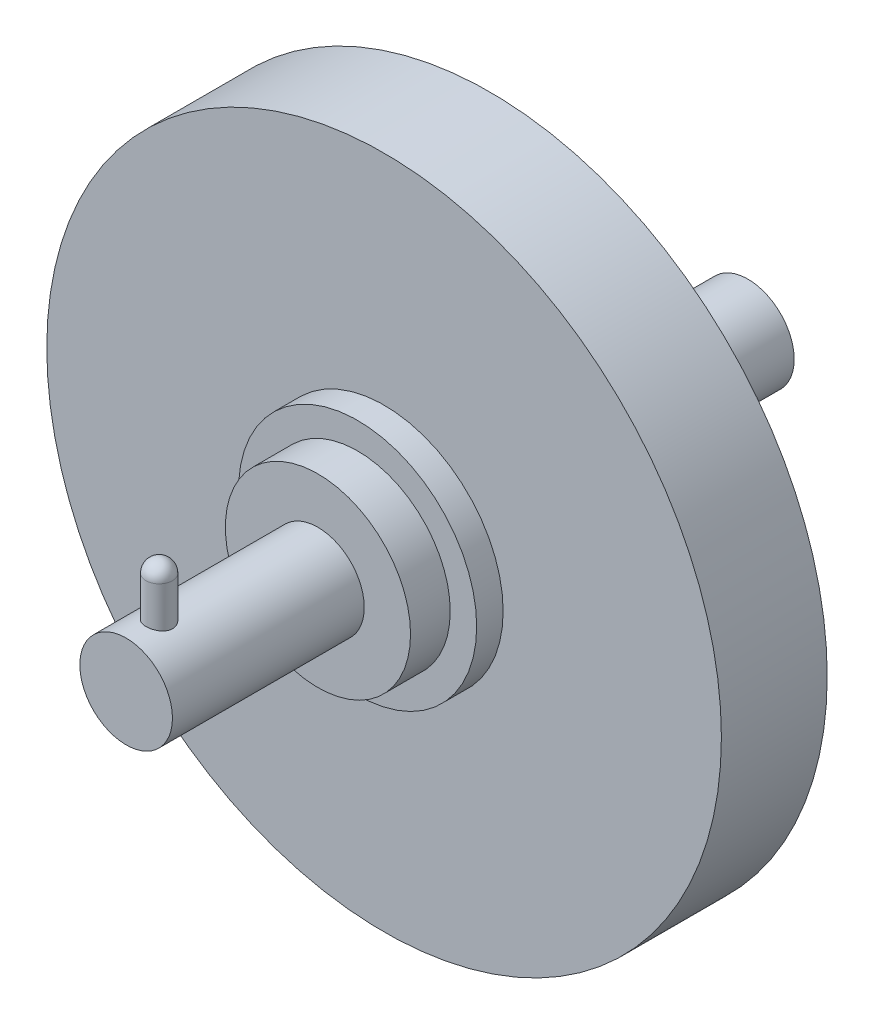
ISO-10303-21;
HEADER;
FILE_DESCRIPTION(('STEP AP214'),'2;1');
FILE_NAME('part.step','',(''),(''),'','','');
FILE_SCHEMA(('AUTOMOTIVE_DESIGN { 1 0 10303 214 1 1 1 1 }'));
ENDSEC;
DATA;
#1=APPLICATION_CONTEXT('core data for automotive mechanical design processes');
#2=APPLICATION_PROTOCOL_DEFINITION('international standard','automotive_design',2000,#1);
#3=PRODUCT_CONTEXT('',#1,'mechanical');
#4=PRODUCT('Part','Part','',(#3));
#5=PRODUCT_RELATED_PRODUCT_CATEGORY('part','',(#4));
#6=PRODUCT_DEFINITION_FORMATION('','',#4);
#7=PRODUCT_DEFINITION_CONTEXT('part definition',#1,'design');
#8=PRODUCT_DEFINITION('design','',#6,#7);
#9=PRODUCT_DEFINITION_SHAPE('','',#8);
#10=(LENGTH_UNIT() NAMED_UNIT(*) SI_UNIT(.MILLI.,.METRE.));
#11=(NAMED_UNIT(*) PLANE_ANGLE_UNIT() SI_UNIT($,.RADIAN.));
#12=(NAMED_UNIT(*) SI_UNIT($,.STERADIAN.) SOLID_ANGLE_UNIT());
#13=UNCERTAINTY_MEASURE_WITH_UNIT(LENGTH_MEASURE(1.E-05),#10,'distance_accuracy_value','');
#14=(GEOMETRIC_REPRESENTATION_CONTEXT(3) GLOBAL_UNCERTAINTY_ASSIGNED_CONTEXT((#13)) GLOBAL_UNIT_ASSIGNED_CONTEXT((#10,
#11,#12)) REPRESENTATION_CONTEXT('',''));
#15=CARTESIAN_POINT('',(0.,0.,0.));
#16=DIRECTION('',(0.,0.,1.));
#17=DIRECTION('',(1.,0.,0.));
#18=AXIS2_PLACEMENT_3D('',#15,#16,#17);
#19=CARTESIAN_POINT('',(0.,0.,101.6));
#20=DIRECTION('',(0.,0.,-1.));
#21=DIRECTION('',(-1.,0.,0.));
#22=AXIS2_PLACEMENT_3D('',#19,#20,#21);
#23=CYLINDRICAL_SURFACE('',#22,323.85);
#24=CARTESIAN_POINT('',(0.,0.,101.6));
#25=DIRECTION('',(0.,0.,1.));
#26=DIRECTION('',(1.,0.,0.));
#27=AXIS2_PLACEMENT_3D('',#24,#25,#26);
#28=CIRCLE('',#27,323.85);
#29=CARTESIAN_POINT('',(323.85,0.,101.6));
#30=VERTEX_POINT('',#29);
#31=EDGE_CURVE('E146',#30,#30,#28,.T.);
#32=ORIENTED_EDGE('',*,*,#31,.F.);
#33=EDGE_LOOP('',(#32));
#34=FACE_BOUND('',#33,.T.);
#35=CARTESIAN_POINT('',(0.,0.,0.));
#36=DIRECTION('',(0.,0.,1.));
#37=DIRECTION('',(1.,0.,0.));
#38=AXIS2_PLACEMENT_3D('',#35,#36,#37);
#39=CIRCLE('',#38,323.85);
#40=CARTESIAN_POINT('',(323.85,0.,0.));
#41=VERTEX_POINT('',#40);
#42=EDGE_CURVE('E149',#41,#41,#39,.T.);
#43=ORIENTED_EDGE('',*,*,#42,.T.);
#44=EDGE_LOOP('',(#43));
#45=FACE_BOUND('',#44,.T.);
#46=ADVANCED_FACE('F33',(#34,#45),#23,.T.);
#47=CARTESIAN_POINT('',(0.,0.,101.6));
#48=DIRECTION('',(0.,0.,1.));
#49=DIRECTION('',(1.,0.,0.));
#50=AXIS2_PLACEMENT_3D('',#47,#48,#49);
#51=PLANE('',#50);
#52=CARTESIAN_POINT('',(0.,0.,101.6));
#53=DIRECTION('',(0.,0.,1.));
#54=DIRECTION('',(1.,0.,0.));
#55=AXIS2_PLACEMENT_3D('',#52,#53,#54);
#56=CIRCLE('',#55,114.3);
#57=CARTESIAN_POINT('',(114.3,0.,101.6));
#58=VERTEX_POINT('',#57);
#59=EDGE_CURVE('E143',#58,#58,#56,.T.);
#60=ORIENTED_EDGE('',*,*,#59,.F.);
#61=EDGE_LOOP('',(#60));
#62=FACE_BOUND('',#61,.T.);
#63=ORIENTED_EDGE('',*,*,#31,.T.);
#64=EDGE_LOOP('',(#63));
#65=FACE_BOUND('',#64,.T.);
#66=ADVANCED_FACE('F84',(#62,#65),#51,.T.);
#67=CARTESIAN_POINT('',(0.,0.,0.));
#68=DIRECTION('',(0.,0.,1.));
#69=DIRECTION('',(1.,0.,0.));
#70=AXIS2_PLACEMENT_3D('',#67,#68,#69);
#71=PLANE('',#70);
#72=CARTESIAN_POINT('',(0.,0.,0.));
#73=DIRECTION('',(0.,0.,1.));
#74=DIRECTION('',(1.,0.,0.));
#75=AXIS2_PLACEMENT_3D('',#72,#73,#74);
#76=CIRCLE('',#75,114.3);
#77=CARTESIAN_POINT('',(114.3,0.,0.));
#78=VERTEX_POINT('',#77);
#79=EDGE_CURVE('E142',#78,#78,#76,.T.);
#80=ORIENTED_EDGE('',*,*,#79,.T.);
#81=EDGE_LOOP('',(#80));
#82=FACE_BOUND('',#81,.T.);
#83=ORIENTED_EDGE('',*,*,#42,.F.);
#84=EDGE_LOOP('',(#83));
#85=FACE_BOUND('',#84,.T.);
#86=ADVANCED_FACE('F89',(#82,#85),#71,.F.);
#87=CARTESIAN_POINT('',(0.,0.,-25.4));
#88=DIRECTION('',(0.,0.,1.));
#89=DIRECTION('',(1.,0.,0.));
#90=AXIS2_PLACEMENT_3D('',#87,#88,#89);
#91=PLANE('',#90);
#92=CARTESIAN_POINT('',(0.,0.,-25.4));
#93=DIRECTION('',(0.,0.,1.));
#94=DIRECTION('',(1.,0.,0.));
#95=AXIS2_PLACEMENT_3D('',#92,#93,#94);
#96=CIRCLE('',#95,88.9);
#97=CARTESIAN_POINT('',(88.9,0.,-25.4));
#98=VERTEX_POINT('',#97);
#99=EDGE_CURVE('E128',#98,#98,#96,.T.);
#100=ORIENTED_EDGE('',*,*,#99,.T.);
#101=EDGE_LOOP('',(#100));
#102=FACE_BOUND('',#101,.T.);
#103=CARTESIAN_POINT('',(0.,0.,-25.4));
#104=DIRECTION('',(0.,0.,1.));
#105=DIRECTION('',(1.,0.,0.));
#106=AXIS2_PLACEMENT_3D('',#103,#104,#105);
#107=CIRCLE('',#106,114.3);
#108=CARTESIAN_POINT('',(114.3,0.,-25.4));
#109=VERTEX_POINT('',#108);
#110=EDGE_CURVE('E139',#109,#109,#107,.T.);
#111=ORIENTED_EDGE('',*,*,#110,.F.);
#112=EDGE_LOOP('',(#111));
#113=FACE_BOUND('',#112,.T.);
#114=ADVANCED_FACE('F96',(#102,#113),#91,.F.);
#115=CARTESIAN_POINT('',(0.,0.,-25.4));
#116=DIRECTION('',(0.,0.,1.));
#117=DIRECTION('',(1.,0.,0.));
#118=AXIS2_PLACEMENT_3D('',#115,#116,#117);
#119=CYLINDRICAL_SURFACE('',#118,114.3);
#120=ORIENTED_EDGE('',*,*,#110,.T.);
#121=EDGE_LOOP('',(#120));
#122=FACE_BOUND('',#121,.T.);
#123=ORIENTED_EDGE('',*,*,#79,.F.);
#124=EDGE_LOOP('',(#123));
#125=FACE_BOUND('',#124,.T.);
#126=ADVANCED_FACE('F103',(#122,#125),#119,.T.);
#127=ORIENTED_EDGE('',*,*,#59,.T.);
#128=EDGE_LOOP('',(#127));
#129=FACE_BOUND('',#128,.T.);
#130=CARTESIAN_POINT('',(0.,0.,127.));
#131=DIRECTION('',(0.,0.,1.));
#132=DIRECTION('',(1.,0.,0.));
#133=AXIS2_PLACEMENT_3D('',#130,#131,#132);
#134=CIRCLE('',#133,114.3);
#135=CARTESIAN_POINT('',(114.3,0.,127.));
#136=VERTEX_POINT('',#135);
#137=EDGE_CURVE('E136',#136,#136,#134,.T.);
#138=ORIENTED_EDGE('',*,*,#137,.F.);
#139=EDGE_LOOP('',(#138));
#140=FACE_BOUND('',#139,.T.);
#141=ADVANCED_FACE('F99',(#129,#140),#119,.T.);
#142=CARTESIAN_POINT('',(0.,0.,127.));
#143=DIRECTION('',(0.,0.,1.));
#144=DIRECTION('',(1.,0.,0.));
#145=AXIS2_PLACEMENT_3D('',#142,#143,#144);
#146=PLANE('',#145);
#147=CARTESIAN_POINT('',(0.,0.,127.));
#148=DIRECTION('',(0.,0.,1.));
#149=DIRECTION('',(1.,0.,0.));
#150=AXIS2_PLACEMENT_3D('',#147,#148,#149);
#151=CIRCLE('',#150,88.9);
#152=CARTESIAN_POINT('',(88.9,0.,127.));
#153=VERTEX_POINT('',#152);
#154=EDGE_CURVE('E48',#153,#153,#151,.T.);
#155=ORIENTED_EDGE('',*,*,#154,.F.);
#156=EDGE_LOOP('',(#155));
#157=FACE_BOUND('',#156,.T.);
#158=ORIENTED_EDGE('',*,*,#137,.T.);
#159=EDGE_LOOP('',(#158));
#160=FACE_BOUND('',#159,.T.);
#161=ADVANCED_FACE('F102',(#157,#160),#146,.T.);
#162=CARTESIAN_POINT('',(0.,0.,165.1));
#163=DIRECTION('',(0.,0.,1.));
#164=DIRECTION('',(1.,0.,0.));
#165=AXIS2_PLACEMENT_3D('',#162,#163,#164);
#166=PLANE('',#165);
#167=CARTESIAN_POINT('',(0.,0.,165.1));
#168=DIRECTION('',(0.,0.,1.));
#169=DIRECTION('',(1.,0.,0.));
#170=AXIS2_PLACEMENT_3D('',#167,#168,#169);
#171=CIRCLE('',#170,44.45);
#172=CARTESIAN_POINT('',(44.45,0.,165.1));
#173=VERTEX_POINT('',#172);
#174=EDGE_CURVE('E44',#173,#173,#171,.T.);
#175=ORIENTED_EDGE('',*,*,#174,.F.);
#176=EDGE_LOOP('',(#175));
#177=FACE_BOUND('',#176,.T.);
#178=CARTESIAN_POINT('',(0.,0.,165.1));
#179=DIRECTION('',(0.,0.,1.));
#180=DIRECTION('',(1.,0.,0.));
#181=AXIS2_PLACEMENT_3D('',#178,#179,#180);
#182=CIRCLE('',#181,88.9);
#183=CARTESIAN_POINT('',(88.9,0.,165.1));
#184=VERTEX_POINT('',#183);
#185=EDGE_CURVE('E123',#184,#184,#182,.T.);
#186=ORIENTED_EDGE('',*,*,#185,.T.);
#187=EDGE_LOOP('',(#186));
#188=FACE_BOUND('',#187,.T.);
#189=ADVANCED_FACE('F110',(#177,#188),#166,.T.);
#190=CARTESIAN_POINT('',(0.,0.,-63.5));
#191=DIRECTION('',(0.,0.,1.));
#192=DIRECTION('',(1.,0.,0.));
#193=AXIS2_PLACEMENT_3D('',#190,#191,#192);
#194=CYLINDRICAL_SURFACE('',#193,88.9);
#195=ORIENTED_EDGE('',*,*,#154,.T.);
#196=EDGE_LOOP('',(#195));
#197=FACE_BOUND('',#196,.T.);
#198=ORIENTED_EDGE('',*,*,#185,.F.);
#199=EDGE_LOOP('',(#198));
#200=FACE_BOUND('',#199,.T.);
#201=ADVANCED_FACE('F112',(#197,#200),#194,.T.);
#202=CARTESIAN_POINT('',(0.,0.,-63.5));
#203=DIRECTION('',(0.,0.,1.));
#204=DIRECTION('',(1.,0.,0.));
#205=AXIS2_PLACEMENT_3D('',#202,#203,#204);
#206=CIRCLE('',#205,88.9);
#207=CARTESIAN_POINT('',(88.9,0.,-63.5));
#208=VERTEX_POINT('',#207);
#209=EDGE_CURVE('E125',#208,#208,#206,.T.);
#210=ORIENTED_EDGE('',*,*,#209,.T.);
#211=EDGE_LOOP('',(#210));
#212=FACE_BOUND('',#211,.T.);
#213=ORIENTED_EDGE('',*,*,#99,.F.);
#214=EDGE_LOOP('',(#213));
#215=FACE_BOUND('',#214,.T.);
#216=ADVANCED_FACE('F79',(#212,#215),#194,.T.);
#217=CARTESIAN_POINT('',(0.,0.,-63.5));
#218=DIRECTION('',(0.,0.,1.));
#219=DIRECTION('',(1.,0.,0.));
#220=AXIS2_PLACEMENT_3D('',#217,#218,#219);
#221=PLANE('',#220);
#222=CARTESIAN_POINT('',(0.,0.,-63.5));
#223=DIRECTION('',(0.,0.,1.));
#224=DIRECTION('',(1.,0.,0.));
#225=AXIS2_PLACEMENT_3D('',#222,#223,#224);
#226=CIRCLE('',#225,44.45);
#227=CARTESIAN_POINT('',(44.45,0.,-63.5));
#228=VERTEX_POINT('',#227);
#229=EDGE_CURVE('E56',#228,#228,#226,.T.);
#230=ORIENTED_EDGE('',*,*,#229,.T.);
#231=EDGE_LOOP('',(#230));
#232=FACE_BOUND('',#231,.T.);
#233=ORIENTED_EDGE('',*,*,#209,.F.);
#234=EDGE_LOOP('',(#233));
#235=FACE_BOUND('',#234,.T.);
#236=ADVANCED_FACE('F72',(#232,#235),#221,.F.);
#237=CARTESIAN_POINT('',(0.,0.,-247.65));
#238=DIRECTION('',(0.,0.,1.));
#239=DIRECTION('',(1.,0.,0.));
#240=AXIS2_PLACEMENT_3D('',#237,#238,#239);
#241=PLANE('',#240);
#242=CARTESIAN_POINT('',(0.,0.,-247.65));
#243=DIRECTION('',(0.,0.,1.));
#244=DIRECTION('',(1.,0.,0.));
#245=AXIS2_PLACEMENT_3D('',#242,#243,#244);
#246=CIRCLE('',#245,44.45);
#247=CARTESIAN_POINT('',(44.45,0.,-247.65));
#248=VERTEX_POINT('',#247);
#249=EDGE_CURVE('E131',#248,#248,#246,.T.);
#250=ORIENTED_EDGE('',*,*,#249,.F.);
#251=EDGE_LOOP('',(#250));
#252=FACE_BOUND('',#251,.T.);
#253=ADVANCED_FACE('F69',(#252),#241,.F.);
#254=CARTESIAN_POINT('',(0.,0.,-247.65));
#255=DIRECTION('',(0.,0.,1.));
#256=DIRECTION('',(1.,0.,0.));
#257=AXIS2_PLACEMENT_3D('',#254,#255,#256);
#258=CYLINDRICAL_SURFACE('',#257,44.45);
#259=ORIENTED_EDGE('',*,*,#249,.T.);
#260=EDGE_LOOP('',(#259));
#261=FACE_BOUND('',#260,.T.);
#262=ORIENTED_EDGE('',*,*,#229,.F.);
#263=EDGE_LOOP('',(#262));
#264=FACE_BOUND('',#263,.T.);
#265=ADVANCED_FACE('F71',(#261,#264),#258,.T.);
#266=CARTESIAN_POINT('',(0.,44.45,330.2));
#267=CARTESIAN_POINT('',(0.34912497612622,44.4499994094419,330.199999047091));
#268=CARTESIAN_POINT('',(0.698267379448772,44.4458768510917,330.185591787749));
#269=CARTESIAN_POINT('',(1.3940010132651,44.4294988891921,330.128088564488));
#270=CARTESIAN_POINT('',(1.74059207216971,44.4172429435988,330.084990688503));
#271=CARTESIAN_POINT('',(2.42880969481122,44.3849309543297,329.9704695731));
#272=CARTESIAN_POINT('',(2.77043457305232,44.364872323751,329.899036939419));
#273=CARTESIAN_POINT('',(3.44616991307215,44.3175037645278,329.728464530747));
#274=CARTESIAN_POINT('',(3.78028047153237,44.2901939292375,329.62932511246));
#275=CARTESIAN_POINT('',(4.43822660429697,44.2291042018982,329.404320921342));
#276=CARTESIAN_POINT('',(4.76207609677708,44.1953335533795,329.27849430247));
#277=CARTESIAN_POINT('',(5.39785439954452,44.1221947878867,329.001020561675));
#278=CARTESIAN_POINT('',(5.70978318506241,44.0828266592826,328.849373386104));
#279=CARTESIAN_POINT('',(6.31969833851191,43.9995301115296,328.521401617828));
#280=CARTESIAN_POINT('',(6.61768616908506,43.9556021723455,328.34507962171));
#281=CARTESIAN_POINT('',(7.19801545909231,43.8643066669764,327.968915511544));
#282=CARTESIAN_POINT('',(7.48035129133267,43.8169378776994,327.76906501818));
#283=CARTESIAN_POINT('',(8.03398876919608,43.7188564895558,327.342258116834));
#284=CARTESIAN_POINT('',(8.30487534689936,43.6680914777267,327.114775200588));
#285=CARTESIAN_POINT('',(8.82664787461666,43.5656228311395,326.638115566193));
#286=CARTESIAN_POINT('',(9.0775335116019,43.5139191817066,326.388938508642));
#287=CARTESIAN_POINT('',(9.5577849988523,43.4109616296781,325.870404005644));
#288=CARTESIAN_POINT('',(9.78714395005924,43.3597078760072,325.601040139959));
#289=CARTESIAN_POINT('',(10.2226739561878,43.2590960141506,325.043997008385));
#290=CARTESIAN_POINT('',(10.4288530144177,43.2097372555813,324.756324118101));
#291=CARTESIAN_POINT('',(10.8206517530003,43.1133104450408,324.158365909138));
#292=CARTESIAN_POINT('',(11.005768343478,43.0663093490096,323.847739814488));
#293=CARTESIAN_POINT('',(11.3490951717422,42.9771103716091,323.211284906269));
#294=CARTESIAN_POINT('',(11.5073049533881,42.9349125716722,322.885455835088));
#295=CARTESIAN_POINT('',(11.7955178832091,42.8566280826421,322.220900968998));
#296=CARTESIAN_POINT('',(11.9255257596808,42.8205403693623,321.882177347185));
#297=CARTESIAN_POINT('',(12.1562474759701,42.7556140069083,321.194220230166));
#298=CARTESIAN_POINT('',(12.2569622532631,42.7267751257515,320.844987071694));
#299=CARTESIAN_POINT('',(12.4259881778147,42.6779200787544,320.147678830192));
#300=CARTESIAN_POINT('',(12.495063706278,42.6576967213501,319.799803497621));
#301=CARTESIAN_POINT('',(12.6039094246942,42.6256636004401,319.099112732694));
#302=CARTESIAN_POINT('',(12.6436800721641,42.613853705581,318.74629737755));
#303=CARTESIAN_POINT('',(12.6935385863917,42.5990288336652,318.038457690359));
#304=CARTESIAN_POINT('',(12.7036320590451,42.5960121955997,317.683433788195));
#305=CARTESIAN_POINT('',(12.6940554344368,42.5988671692686,316.973827267909));
#306=CARTESIAN_POINT('',(12.6743859063252,42.6047386110387,316.619244641479));
#307=CARTESIAN_POINT('',(12.6065929482022,42.6248461041545,315.924693478541));
#308=CARTESIAN_POINT('',(12.559413926085,42.6388044334019,315.584624194852));
#309=CARTESIAN_POINT('',(12.4377852719433,42.6744420893893,314.909820095335));
#310=CARTESIAN_POINT('',(12.3633363176017,42.6961212242599,314.575085147159));
#311=CARTESIAN_POINT('',(12.1877878155935,42.7465630956683,313.913209715358));
#312=CARTESIAN_POINT('',(12.0866866172139,42.7753262709505,313.586069703492));
#313=CARTESIAN_POINT('',(11.8586435311776,42.8391068819172,312.941553765404));
#314=CARTESIAN_POINT('',(11.7317011233319,42.8741244435021,312.624178035886));
#315=CARTESIAN_POINT('',(11.4511725162325,42.9499069977301,311.997267708771));
#316=CARTESIAN_POINT('',(11.2972699891574,42.9907390082692,311.687882816253));
#317=CARTESIAN_POINT('',(10.9650704733274,43.0766659551306,311.08312715462));
#318=CARTESIAN_POINT('',(10.7867733790537,43.1217609098922,310.787756446131));
#319=CARTESIAN_POINT('',(10.4069702608012,43.214993897272,310.212771044786));
#320=CARTESIAN_POINT('',(10.2054602030314,43.2631324581298,309.933159102992));
#321=CARTESIAN_POINT('',(9.7805538119734,43.3611669260551,309.391406491772));
#322=CARTESIAN_POINT('',(9.55715644433025,43.4110629161041,309.129266649031));
#323=CARTESIAN_POINT('',(9.08104593080391,43.5132000491619,308.614500271974));
#324=CARTESIAN_POINT('',(8.82754496785334,43.5654586735929,308.362605258885));
#325=CARTESIAN_POINT('',(8.30011122117008,43.6690149791472,307.880972015263));
#326=CARTESIAN_POINT('',(8.02617791731951,43.720312635767,307.651234349101));
#327=CARTESIAN_POINT('',(7.45961950600821,43.820535419367,307.215457970223));
#328=CARTESIAN_POINT('',(7.16699292362387,43.8694603585997,307.009421131134));
#329=CARTESIAN_POINT('',(6.56497658212727,43.9635801984794,306.622541675582));
#330=CARTESIAN_POINT('',(6.25558752461954,44.0087752550435,306.441698005771));
#331=CARTESIAN_POINT('',(5.62029168298146,44.0944227351352,306.10560734337));
#332=CARTESIAN_POINT('',(5.29430139395532,44.1348468973658,305.950510864321));
#333=CARTESIAN_POINT('',(4.6296854630416,44.2095048454722,305.668418055378));
#334=CARTESIAN_POINT('',(4.29105971816583,44.2437385808783,305.541421954581));
#335=CARTESIAN_POINT('',(3.60368470981779,44.3050220573182,305.316643358447));
#336=CARTESIAN_POINT('',(3.25493753577244,44.3320732695448,305.218854880014));
#337=CARTESIAN_POINT('',(2.54986544882089,44.3782094620071,305.05334169326));
#338=CARTESIAN_POINT('',(2.19354078520619,44.3972947038901,304.985615997503));
#339=CARTESIAN_POINT('',(1.48784186434859,44.4264496428669,304.882580189334));
#340=CARTESIAN_POINT('',(1.13862340982303,44.4367947192116,304.846278979802));
#341=CARTESIAN_POINT('',(0.438235911845092,44.449219448824,304.802714833461));
#342=CARTESIAN_POINT('',(0.0870669112657959,44.4512992830477,304.795451260913));
#343=CARTESIAN_POINT('',(-0.614576730539197,44.4471356491359,304.810027019012));
#344=CARTESIAN_POINT('',(-0.965051443330692,44.4408930889279,304.831863175039));
#345=CARTESIAN_POINT('',(-1.66275073525695,44.4202607169409,304.904434489194));
#346=CARTESIAN_POINT('',(-2.00997533393824,44.405870954192,304.955169473408));
#347=CARTESIAN_POINT('',(-2.69168014363101,44.3697139971179,305.083771143773));
#348=CARTESIAN_POINT('',(-3.02627611325173,44.3481016767682,305.161069147357));
#349=CARTESIAN_POINT('',(-3.68762891285121,44.2980120524893,305.342329469992));
#350=CARTESIAN_POINT('',(-4.01438587888696,44.2695348678046,305.446291325888));
#351=CARTESIAN_POINT('',(-4.65793190589658,44.2064556850375,305.680064121083));
#352=CARTESIAN_POINT('',(-4.97472014628468,44.1718531842887,305.809877181939));
#353=CARTESIAN_POINT('',(-5.59628710010202,44.0974155664936,306.094369836242));
#354=CARTESIAN_POINT('',(-5.90106554046768,44.057580330561,306.249049994681));
#355=CARTESIAN_POINT('',(-6.50318130847997,43.9727820607284,306.585781055255));
#356=CARTESIAN_POINT('',(-6.80021493866373,43.9277267244167,306.76835177227));
#357=CARTESIAN_POINT('',(-7.37793229184974,43.8343957494089,307.157015583007));
#358=CARTESIAN_POINT('',(-7.65861582741903,43.7861200738094,307.363108946307));
#359=CARTESIAN_POINT('',(-8.20196986913582,43.6876006736836,307.797490322621));
#360=CARTESIAN_POINT('',(-8.46463678570373,43.6373565600862,308.025782736731));
#361=CARTESIAN_POINT('',(-8.9702973759542,43.5362235590521,308.503075696521));
#362=CARTESIAN_POINT('',(-9.21329072094251,43.4853346608591,308.752076588044));
#363=CARTESIAN_POINT('',(-9.68571890573693,43.3825966864725,309.277727057084));
#364=CARTESIAN_POINT('',(-9.91444903884768,43.3307707492019,309.555015075475));
#365=CARTESIAN_POINT('',(-10.3477690223317,43.2293385347126,310.128245087296));
#366=CARTESIAN_POINT('',(-10.5523582930595,43.1797323108092,310.424187528375));
#367=CARTESIAN_POINT('',(-10.9359308837687,43.0841849919749,311.032791085915));
#368=CARTESIAN_POINT('',(-11.1149144562915,43.0382438608983,311.345452037444));
#369=CARTESIAN_POINT('',(-11.4459182497446,42.9513998621206,311.985407993798));
#370=CARTESIAN_POINT('',(-11.5979389080102,42.9104969127041,312.312702761156));
#371=CARTESIAN_POINT('',(-11.8730521459899,42.8351885726294,312.977890320509));
#372=CARTESIAN_POINT('',(-11.9962950226126,42.8007496167686,313.315717105547));
#373=CARTESIAN_POINT('',(-12.2138389167997,42.7391791571089,314.001222655477));
#374=CARTESIAN_POINT('',(-12.3081399388467,42.7120476521781,314.348901418842));
#375=CARTESIAN_POINT('',(-12.4669263138404,42.6659711358513,315.051447504138));
#376=CARTESIAN_POINT('',(-12.5314192390111,42.6470240454283,315.406312976475));
#377=CARTESIAN_POINT('',(-12.6300122203346,42.6179298742622,316.120595185202));
#378=CARTESIAN_POINT('',(-12.6641132975484,42.6077824978794,316.480011768279));
#379=CARTESIAN_POINT('',(-12.7008865356926,42.5968346596554,317.186958437953));
#380=CARTESIAN_POINT('',(-12.7046975064125,42.5956955256492,317.53442453861));
#381=CARTESIAN_POINT('',(-12.6838446009739,42.6019096617443,318.22841860504));
#382=CARTESIAN_POINT('',(-12.6591814795888,42.6092627067402,318.574946595437));
#383=CARTESIAN_POINT('',(-12.5816063588107,42.6322332286169,319.264530345254));
#384=CARTESIAN_POINT('',(-12.5286954707155,42.6478503803785,319.60758624073));
#385=CARTESIAN_POINT('',(-12.3950939121329,42.6868712914339,320.287791456593));
#386=CARTESIAN_POINT('',(-12.3144031046633,42.7102750891234,320.624940747846));
#387=CARTESIAN_POINT('',(-12.1268964184677,42.7638898904008,321.287576164005));
#388=CARTESIAN_POINT('',(-12.0203566915064,42.7940286895429,321.613146396175));
#389=CARTESIAN_POINT('',(-11.7815842698026,42.8603792908823,322.254074502974));
#390=CARTESIAN_POINT('',(-11.6493518588013,42.8965910260116,322.56943249034));
#391=CARTESIAN_POINT('',(-11.360187061043,42.9740740389419,323.187942593579));
#392=CARTESIAN_POINT('',(-11.2032557189454,43.0153451027385,323.491095225006));
#393=CARTESIAN_POINT('',(-10.8657275882325,43.1018423559154,324.083481340808));
#394=CARTESIAN_POINT('',(-10.6851217315363,43.147070058593,324.37270943331));
#395=CARTESIAN_POINT('',(-10.2951500748958,43.2418079085436,324.944703769946));
#396=CARTESIAN_POINT('',(-10.0850321380388,43.2914101033704,325.226942200228));
#397=CARTESIAN_POINT('',(-9.64217003270829,43.3921955814127,325.77297950412));
#398=CARTESIAN_POINT('',(-9.40941555882165,43.4433795774497,326.036769884317));
#399=CARTESIAN_POINT('',(-8.92279393503294,43.5459306570317,326.544188425157));
#400=CARTESIAN_POINT('',(-8.66892168389633,43.5972977819285,326.787811685684));
#401=CARTESIAN_POINT('',(-8.14182378656379,43.6988008522779,327.253166145024));
#402=CARTESIAN_POINT('',(-7.86860670972896,43.7489373297904,327.474906934401));
#403=CARTESIAN_POINT('',(-7.29703699105803,43.8479422150279,327.900650365132));
#404=CARTESIAN_POINT('',(-6.99821401669784,43.8967432250667,328.104037875432));
#405=CARTESIAN_POINT('',(-6.38396706325597,43.9902707734379,328.484783990616));
#406=CARTESIAN_POINT('',(-6.06854929276246,44.0349988187191,328.662152237282));
#407=CARTESIAN_POINT('',(-5.42324325827703,44.1191202227436,328.989529907158));
#408=CARTESIAN_POINT('',(-5.09335892936775,44.1585150204252,329.139546713734));
#409=CARTESIAN_POINT('',(-4.4213806135626,44.2308493366209,329.411031441318));
#410=CARTESIAN_POINT('',(-4.07928801715583,44.2637895875342,329.532502601721));
#411=CARTESIAN_POINT('',(-3.43125850001423,44.3183970621499,329.731750576215));
#412=CARTESIAN_POINT('',(-3.12651572699343,44.3409786629686,329.813179832314));
#413=CARTESIAN_POINT('',(-2.51133908745579,44.3800706606552,329.953220654868));
#414=CARTESIAN_POINT('',(-2.20090355835547,44.3965792532563,330.011825440565));
#415=CARTESIAN_POINT('',(-1.57628743412783,44.4231416887084,330.105754622164));
#416=CARTESIAN_POINT('',(-1.26210722380454,44.4331961890565,330.141081389475));
#417=CARTESIAN_POINT('',(-0.631955679975246,44.4466245000016,330.188200592501));
#418=CARTESIAN_POINT('',(-0.315984977856457,44.4500005345006,330.200000862456));
#419=CARTESIAN_POINT('',(0.,44.45,330.2));
#420=B_SPLINE_CURVE_WITH_KNOTS('',3,(#266,#267,#268,#269,#270,#271,#272,#273,#274,#275,#276,
#277,#278,#279,#280,#281,#282,#283,#284,#285,#286,#287,#288,#289,#290,#291,#292,#293,#294,#295,
#296,#297,#298,#299,#300,#301,#302,#303,#304,#305,#306,#307,#308,#309,#310,#311,#312,#313,#314,
#315,#316,#317,#318,#319,#320,#321,#322,#323,#324,#325,#326,#327,#328,#329,#330,#331,#332,#333,
#334,#335,#336,#337,#338,#339,#340,#341,#342,#343,#344,#345,#346,#347,#348,#349,#350,#351,#352,
#353,#354,#355,#356,#357,#358,#359,#360,#361,#362,#363,#364,#365,#366,#367,#368,#369,#370,#371,
#372,#373,#374,#375,#376,#377,#378,#379,#380,#381,#382,#383,#384,#385,#386,#387,#388,#389,#390,
#391,#392,#393,#394,#395,#396,#397,#398,#399,#400,#401,#402,#403,#404,#405,#406,#407,#408,#409,
#410,#411,#412,#413,#414,#415,#416,#417,#418,#419),.UNSPECIFIED.,.T.,.F.,(4,2,2,2,2,2,2,2,2,2,2,
2,2,2,2,2,2,2,2,2,2,2,2,2,2,2,2,2,2,2,2,2,2,2,2,2,2,2,2,2,2,2,2,2,2,2,2,2,2,2,2,2,2,2,2,2,2,2,2,
2,2,2,2,2,2,2,2,2,2,2,2,2,2,2,2,2,4),(0.,1.04708489241771,2.09423957406769,3.14174172576503,
4.18923039226517,5.23523146775046,6.28123471654999,7.32712797470265,8.37339484499652,
9.44424229514508,10.5151065015206,11.5863127440929,12.6571479886248,13.7497496908046,
14.8423699135872,15.9348068071784,17.0272087353475,18.0916109828284,19.1559966121807,
20.2201811705637,21.2843453790815,22.3139643330308,23.343557701739,24.3732148535406,
25.4028927346059,26.4455783555406,27.4882684867599,28.5311400836853,29.5740609886411,
30.6563104391277,31.7385874483522,32.8209499563435,33.9032671962788,34.9917042013109,
36.0801500798376,37.168372840231,38.2565598544484,39.3090260124478,40.3614691280305,
41.4137974372494,42.4661194135875,43.4971873606697,44.5282373991429,45.5593720887047,
46.590530209385,47.6439999533021,48.6974817715281,49.7511728764136,50.8048815821077,
51.8931006815003,52.9813459047727,54.0695803942659,55.157797231105,56.2401967752885,
57.3225961518194,58.4047204124427,59.4868083160578,60.5280112344,61.5691865538171,
62.6103209152847,63.6514604106348,64.6819322661999,65.7123927422263,66.7428096458716,
67.7736223910854,68.838435956413,69.9037365738541,70.9692952780225,72.0343848795834,
73.127313761639,74.2198366158272,75.3120641116012,76.4041676001424,77.3519909987602,
78.3000957649975,79.2481039297282,80.195796358427),.UNSPECIFIED.);
#421=CARTESIAN_POINT('',(0.,44.45,330.2));
#422=VERTEX_POINT('',#421);
#423=EDGE_CURVE('E40',#422,#422,#420,.T.);
#424=ORIENTED_EDGE('',*,*,#423,.F.);
#425=EDGE_LOOP('',(#424));
#426=FACE_BOUND('',#425,.T.);
#427=ORIENTED_EDGE('',*,*,#174,.T.);
#428=EDGE_LOOP('',(#427));
#429=FACE_BOUND('',#428,.T.);
#430=CARTESIAN_POINT('',(0.,0.,349.25));
#431=DIRECTION('',(0.,0.,1.));
#432=DIRECTION('',(1.,0.,0.));
#433=AXIS2_PLACEMENT_3D('',#430,#431,#432);
#434=CIRCLE('',#433,44.45);
#435=CARTESIAN_POINT('',(44.45,0.,349.25));
#436=VERTEX_POINT('',#435);
#437=EDGE_CURVE('E250',#436,#436,#434,.T.);
#438=ORIENTED_EDGE('',*,*,#437,.F.);
#439=EDGE_LOOP('',(#438));
#440=FACE_BOUND('',#439,.T.);
#441=ADVANCED_FACE('F58',(#426,#429,#440),#258,.T.);
#442=CARTESIAN_POINT('',(0.,0.,349.25));
#443=DIRECTION('',(0.,0.,1.));
#444=DIRECTION('',(1.,0.,0.));
#445=AXIS2_PLACEMENT_3D('',#442,#443,#444);
#446=PLANE('',#445);
#447=ORIENTED_EDGE('',*,*,#437,.T.);
#448=EDGE_LOOP('',(#447));
#449=FACE_BOUND('',#448,.T.);
#450=ADVANCED_FACE('F66',(#449),#446,.T.);
#451=CARTESIAN_POINT('',(0.,19.05,317.5));
#452=DIRECTION('',(0.,1.,0.));
#453=DIRECTION('',(0.,0.,1.));
#454=AXIS2_PLACEMENT_3D('',#451,#452,#453);
#455=CYLINDRICAL_SURFACE('',#454,12.7);
#456=CARTESIAN_POINT('',(0.,82.55,317.5));
#457=DIRECTION('',(0.,1.,0.));
#458=DIRECTION('',(0.,0.,1.));
#459=AXIS2_PLACEMENT_3D('',#456,#457,#458);
#460=CIRCLE('',#459,12.7);
#461=CARTESIAN_POINT('',(0.,82.55,330.2));
#462=VERTEX_POINT('',#461);
#463=EDGE_CURVE('E10',#462,#462,#460,.F.);
#464=ORIENTED_EDGE('',*,*,#463,.T.);
#465=EDGE_LOOP('',(#464));
#466=FACE_BOUND('',#465,.T.);
#467=ORIENTED_EDGE('',*,*,#423,.T.);
#468=EDGE_LOOP('',(#467));
#469=FACE_BOUND('',#468,.T.);
#470=ADVANCED_FACE('F62',(#466,#469),#455,.T.);
#471=CARTESIAN_POINT('',(0.,82.55,317.5));
#472=DIRECTION('',(0.,1.,0.));
#473=DIRECTION('',(0.,0.,1.));
#474=AXIS2_PLACEMENT_3D('',#471,#472,#473);
#475=SPHERICAL_SURFACE('',#474,12.7);
#476=ORIENTED_EDGE('',*,*,#463,.F.);
#477=EDGE_LOOP('',(#476));
#478=FACE_BOUND('',#477,.T.);
#479=ADVANCED_FACE('F35',(#478),#475,.T.);
#480=CLOSED_SHELL('',(#46,#66,#86,#114,#126,#141,#161,#189,#201,#216,#236,#253,#265,#441,#450,
#470,#479));
#481=MANIFOLD_SOLID_BREP('B2',#480);
#482=ADVANCED_BREP_SHAPE_REPRESENTATION('',(#18,#481),#14);
#483=SHAPE_DEFINITION_REPRESENTATION(#9,#482);
ENDSEC;
END-ISO-10303-21;
